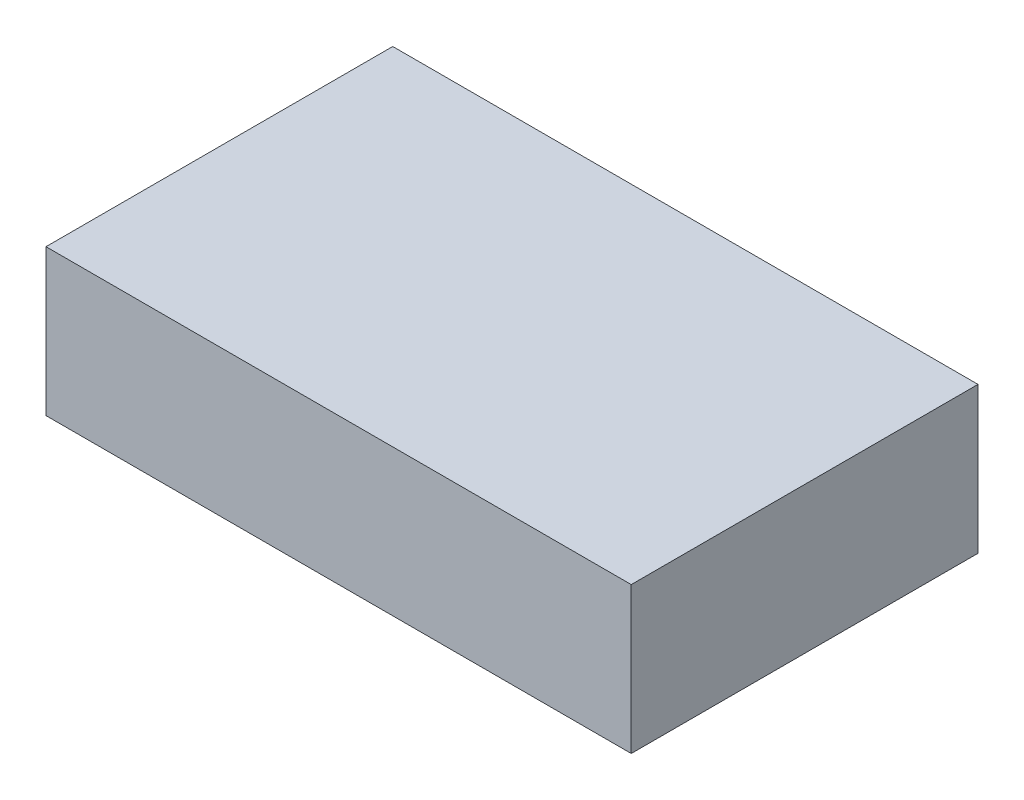
ISO-10303-21;
HEADER;
FILE_DESCRIPTION(('STEP AP214'),'2;1');
FILE_NAME('part.step','',(''),(''),'','','');
FILE_SCHEMA(('AUTOMOTIVE_DESIGN { 1 0 10303 214 1 1 1 1 }'));
ENDSEC;
DATA;
#1=APPLICATION_CONTEXT('core data for automotive mechanical design processes');
#2=APPLICATION_PROTOCOL_DEFINITION('international standard','automotive_design',2000,#1);
#3=PRODUCT_CONTEXT('',#1,'mechanical');
#4=PRODUCT('Part','Part','',(#3));
#5=PRODUCT_RELATED_PRODUCT_CATEGORY('part','',(#4));
#6=PRODUCT_DEFINITION_FORMATION('','',#4);
#7=PRODUCT_DEFINITION_CONTEXT('part definition',#1,'design');
#8=PRODUCT_DEFINITION('design','',#6,#7);
#9=PRODUCT_DEFINITION_SHAPE('','',#8);
#10=(LENGTH_UNIT() NAMED_UNIT(*) SI_UNIT(.MILLI.,.METRE.));
#11=(NAMED_UNIT(*) PLANE_ANGLE_UNIT() SI_UNIT($,.RADIAN.));
#12=(NAMED_UNIT(*) SI_UNIT($,.STERADIAN.) SOLID_ANGLE_UNIT());
#13=UNCERTAINTY_MEASURE_WITH_UNIT(LENGTH_MEASURE(1.E-05),#10,'distance_accuracy_value','');
#14=(GEOMETRIC_REPRESENTATION_CONTEXT(3) GLOBAL_UNCERTAINTY_ASSIGNED_CONTEXT((#13)) GLOBAL_UNIT_ASSIGNED_CONTEXT((#10,
#11,#12)) REPRESENTATION_CONTEXT('',''));
#15=CARTESIAN_POINT('',(0.,0.,0.));
#16=DIRECTION('',(0.,0.,1.));
#17=DIRECTION('',(1.,0.,0.));
#18=AXIS2_PLACEMENT_3D('',#15,#16,#17);
#19=CARTESIAN_POINT('',(0.,10.,0.));
#20=DIRECTION('',(1.,0.,0.));
#21=DIRECTION('',(0.,0.,-1.));
#22=AXIS2_PLACEMENT_3D('',#19,#20,#21);
#23=PLANE('',#22);
#24=DIRECTION('',(0.,0.,1.));
#25=VECTOR('',#24,1.);
#26=CARTESIAN_POINT('',(0.,0.,0.));
#27=LINE('',#26,#25);
#28=CARTESIAN_POINT('',(0.,0.,-23.7));
#29=VERTEX_POINT('',#28);
#30=CARTESIAN_POINT('',(0.,0.,0.));
#31=VERTEX_POINT('',#30);
#32=EDGE_CURVE('E106',#29,#31,#27,.T.);
#33=ORIENTED_EDGE('',*,*,#32,.T.);
#34=DIRECTION('',(0.,-1.,0.));
#35=VECTOR('',#34,1.);
#36=CARTESIAN_POINT('',(0.,10.,0.));
#37=LINE('',#36,#35);
#38=CARTESIAN_POINT('',(0.,10.,0.));
#39=VERTEX_POINT('',#38);
#40=EDGE_CURVE('E11',#39,#31,#37,.T.);
#41=ORIENTED_EDGE('',*,*,#40,.F.);
#42=DIRECTION('',(0.,0.,1.));
#43=VECTOR('',#42,1.);
#44=CARTESIAN_POINT('',(0.,10.,0.));
#45=LINE('',#44,#43);
#46=CARTESIAN_POINT('',(0.,10.,-23.7));
#47=VERTEX_POINT('',#46);
#48=EDGE_CURVE('E92',#47,#39,#45,.T.);
#49=ORIENTED_EDGE('',*,*,#48,.F.);
#50=DIRECTION('',(0.,-1.,0.));
#51=VECTOR('',#50,1.);
#52=CARTESIAN_POINT('',(0.,10.,-23.7));
#53=LINE('',#52,#51);
#54=EDGE_CURVE('E105',#47,#29,#53,.T.);
#55=ORIENTED_EDGE('',*,*,#54,.T.);
#56=EDGE_LOOP('',(#33,#41,#49,#55));
#57=FACE_BOUND('',#56,.T.);
#58=ADVANCED_FACE('F43',(#57),#23,.F.);
#59=CARTESIAN_POINT('',(0.,10.,0.));
#60=DIRECTION('',(0.,0.,-1.));
#61=DIRECTION('',(-1.,0.,0.));
#62=AXIS2_PLACEMENT_3D('',#59,#60,#61);
#63=PLANE('',#62);
#64=DIRECTION('',(1.,0.,0.));
#65=VECTOR('',#64,1.);
#66=CARTESIAN_POINT('',(0.,0.,0.));
#67=LINE('',#66,#65);
#68=CARTESIAN_POINT('',(40.,0.,0.));
#69=VERTEX_POINT('',#68);
#70=EDGE_CURVE('E97',#31,#69,#67,.T.);
#71=ORIENTED_EDGE('',*,*,#70,.T.);
#72=DIRECTION('',(0.,-1.,0.));
#73=VECTOR('',#72,1.);
#74=CARTESIAN_POINT('',(40.,10.,0.));
#75=LINE('',#74,#73);
#76=CARTESIAN_POINT('',(40.,10.,0.));
#77=VERTEX_POINT('',#76);
#78=EDGE_CURVE('E51',#77,#69,#75,.T.);
#79=ORIENTED_EDGE('',*,*,#78,.F.);
#80=DIRECTION('',(1.,0.,0.));
#81=VECTOR('',#80,1.);
#82=CARTESIAN_POINT('',(0.,10.,0.));
#83=LINE('',#82,#81);
#84=EDGE_CURVE('E87',#39,#77,#83,.T.);
#85=ORIENTED_EDGE('',*,*,#84,.F.);
#86=ORIENTED_EDGE('',*,*,#40,.T.);
#87=EDGE_LOOP('',(#71,#79,#85,#86));
#88=FACE_BOUND('',#87,.T.);
#89=ADVANCED_FACE('F100',(#88),#63,.F.);
#90=CARTESIAN_POINT('',(40.,10.,0.));
#91=DIRECTION('',(-1.,0.,0.));
#92=DIRECTION('',(0.,0.,1.));
#93=AXIS2_PLACEMENT_3D('',#90,#91,#92);
#94=PLANE('',#93);
#95=DIRECTION('',(0.,0.,-1.));
#96=VECTOR('',#95,1.);
#97=CARTESIAN_POINT('',(40.,0.,0.));
#98=LINE('',#97,#96);
#99=CARTESIAN_POINT('',(40.,0.,-23.7));
#100=VERTEX_POINT('',#99);
#101=EDGE_CURVE('E78',#69,#100,#98,.T.);
#102=ORIENTED_EDGE('',*,*,#101,.T.);
#103=DIRECTION('',(0.,-1.,0.));
#104=VECTOR('',#103,1.);
#105=CARTESIAN_POINT('',(40.,10.,-23.7));
#106=LINE('',#105,#104);
#107=CARTESIAN_POINT('',(40.,10.,-23.7));
#108=VERTEX_POINT('',#107);
#109=EDGE_CURVE('E98',#108,#100,#106,.T.);
#110=ORIENTED_EDGE('',*,*,#109,.F.);
#111=DIRECTION('',(0.,0.,-1.));
#112=VECTOR('',#111,1.);
#113=CARTESIAN_POINT('',(40.,10.,0.));
#114=LINE('',#113,#112);
#115=EDGE_CURVE('E95',#77,#108,#114,.T.);
#116=ORIENTED_EDGE('',*,*,#115,.F.);
#117=ORIENTED_EDGE('',*,*,#78,.T.);
#118=EDGE_LOOP('',(#102,#110,#116,#117));
#119=FACE_BOUND('',#118,.T.);
#120=ADVANCED_FACE('F99',(#119),#94,.F.);
#121=CARTESIAN_POINT('',(0.,10.,-23.7));
#122=DIRECTION('',(0.,0.,1.));
#123=DIRECTION('',(1.,0.,0.));
#124=AXIS2_PLACEMENT_3D('',#121,#122,#123);
#125=PLANE('',#124);
#126=DIRECTION('',(-1.,0.,0.));
#127=VECTOR('',#126,1.);
#128=CARTESIAN_POINT('',(0.,0.,-23.7));
#129=LINE('',#128,#127);
#130=EDGE_CURVE('E85',#100,#29,#129,.T.);
#131=ORIENTED_EDGE('',*,*,#130,.T.);
#132=ORIENTED_EDGE('',*,*,#54,.F.);
#133=DIRECTION('',(-1.,0.,0.));
#134=VECTOR('',#133,1.);
#135=CARTESIAN_POINT('',(0.,10.,-23.7));
#136=LINE('',#135,#134);
#137=EDGE_CURVE('E56',#108,#47,#136,.T.);
#138=ORIENTED_EDGE('',*,*,#137,.F.);
#139=ORIENTED_EDGE('',*,*,#109,.T.);
#140=EDGE_LOOP('',(#131,#132,#138,#139));
#141=FACE_BOUND('',#140,.T.);
#142=ADVANCED_FACE('F111',(#141),#125,.F.);
#143=CARTESIAN_POINT('',(0.,10.,0.));
#144=DIRECTION('',(0.,-1.,0.));
#145=DIRECTION('',(0.,0.,-1.));
#146=AXIS2_PLACEMENT_3D('',#143,#144,#145);
#147=PLANE('',#146);
#148=ORIENTED_EDGE('',*,*,#48,.T.);
#149=ORIENTED_EDGE('',*,*,#84,.T.);
#150=ORIENTED_EDGE('',*,*,#115,.T.);
#151=ORIENTED_EDGE('',*,*,#137,.T.);
#152=EDGE_LOOP('',(#148,#149,#150,#151));
#153=FACE_BOUND('',#152,.T.);
#154=ADVANCED_FACE('F89',(#153),#147,.F.);
#155=CARTESIAN_POINT('',(0.,0.,0.));
#156=DIRECTION('',(0.,-1.,0.));
#157=DIRECTION('',(0.,0.,-1.));
#158=AXIS2_PLACEMENT_3D('',#155,#156,#157);
#159=PLANE('',#158);
#160=ORIENTED_EDGE('',*,*,#32,.F.);
#161=ORIENTED_EDGE('',*,*,#130,.F.);
#162=ORIENTED_EDGE('',*,*,#101,.F.);
#163=ORIENTED_EDGE('',*,*,#70,.F.);
#164=EDGE_LOOP('',(#160,#161,#162,#163));
#165=FACE_BOUND('',#164,.T.);
#166=ADVANCED_FACE('F116',(#165),#159,.T.);
#167=CLOSED_SHELL('',(#58,#89,#120,#142,#154,#166));
#168=MANIFOLD_SOLID_BREP('B2',#167);
#169=ADVANCED_BREP_SHAPE_REPRESENTATION('',(#18,#168),#14);
#170=SHAPE_DEFINITION_REPRESENTATION(#9,#169);
ENDSEC;
END-ISO-10303-21;
